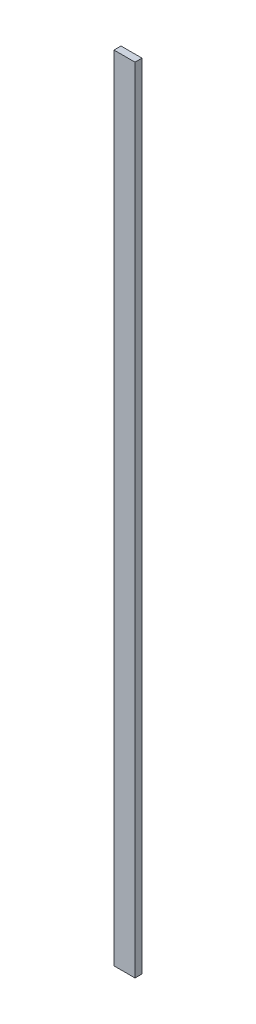
ISO-10303-21;
HEADER;
FILE_DESCRIPTION(('STEP AP214'),'2;1');
FILE_NAME('part.step','',(''),(''),'','','');
FILE_SCHEMA(('AUTOMOTIVE_DESIGN { 1 0 10303 214 1 1 1 1 }'));
ENDSEC;
DATA;
#1=APPLICATION_CONTEXT('core data for automotive mechanical design processes');
#2=APPLICATION_PROTOCOL_DEFINITION('international standard','automotive_design',2000,#1);
#3=PRODUCT_CONTEXT('',#1,'mechanical');
#4=PRODUCT('Part','Part','',(#3));
#5=PRODUCT_RELATED_PRODUCT_CATEGORY('part','',(#4));
#6=PRODUCT_DEFINITION_FORMATION('','',#4);
#7=PRODUCT_DEFINITION_CONTEXT('part definition',#1,'design');
#8=PRODUCT_DEFINITION('design','',#6,#7);
#9=PRODUCT_DEFINITION_SHAPE('','',#8);
#10=(LENGTH_UNIT() NAMED_UNIT(*) SI_UNIT(.MILLI.,.METRE.));
#11=(NAMED_UNIT(*) PLANE_ANGLE_UNIT() SI_UNIT($,.RADIAN.));
#12=(NAMED_UNIT(*) SI_UNIT($,.STERADIAN.) SOLID_ANGLE_UNIT());
#13=UNCERTAINTY_MEASURE_WITH_UNIT(LENGTH_MEASURE(1.E-05),#10,'distance_accuracy_value','');
#14=(GEOMETRIC_REPRESENTATION_CONTEXT(3) GLOBAL_UNCERTAINTY_ASSIGNED_CONTEXT((#13)) GLOBAL_UNIT_ASSIGNED_CONTEXT((#10,
#11,#12)) REPRESENTATION_CONTEXT('',''));
#15=CARTESIAN_POINT('',(0.,0.,0.));
#16=DIRECTION('',(0.,0.,1.));
#17=DIRECTION('',(1.,0.,0.));
#18=AXIS2_PLACEMENT_3D('',#15,#16,#17);
#19=CARTESIAN_POINT('',(45.,3400.,15.));
#20=DIRECTION('',(-1.,0.,0.));
#21=DIRECTION('',(0.,0.,1.));
#22=AXIS2_PLACEMENT_3D('',#19,#20,#21);
#23=PLANE('',#22);
#24=DIRECTION('',(0.,0.,-1.));
#25=VECTOR('',#24,1.);
#26=CARTESIAN_POINT('',(45.,0.,15.));
#27=LINE('',#26,#25);
#28=CARTESIAN_POINT('',(45.,0.,15.));
#29=VERTEX_POINT('',#28);
#30=CARTESIAN_POINT('',(45.,0.,-15.));
#31=VERTEX_POINT('',#30);
#32=EDGE_CURVE('E80',#29,#31,#27,.T.);
#33=ORIENTED_EDGE('',*,*,#32,.T.);
#34=DIRECTION('',(0.,-1.,0.));
#35=VECTOR('',#34,1.);
#36=CARTESIAN_POINT('',(45.,3400.,-15.));
#37=LINE('',#36,#35);
#38=CARTESIAN_POINT('',(45.,3400.,-15.));
#39=VERTEX_POINT('',#38);
#40=EDGE_CURVE('E11',#39,#31,#37,.T.);
#41=ORIENTED_EDGE('',*,*,#40,.F.);
#42=DIRECTION('',(0.,0.,-1.));
#43=VECTOR('',#42,1.);
#44=CARTESIAN_POINT('',(45.,3400.,15.));
#45=LINE('',#44,#43);
#46=CARTESIAN_POINT('',(45.,3400.,15.));
#47=VERTEX_POINT('',#46);
#48=EDGE_CURVE('E68',#47,#39,#45,.T.);
#49=ORIENTED_EDGE('',*,*,#48,.F.);
#50=DIRECTION('',(0.,-1.,0.));
#51=VECTOR('',#50,1.);
#52=CARTESIAN_POINT('',(45.,3400.,15.));
#53=LINE('',#52,#51);
#54=EDGE_CURVE('E76',#47,#29,#53,.T.);
#55=ORIENTED_EDGE('',*,*,#54,.T.);
#56=EDGE_LOOP('',(#33,#41,#49,#55));
#57=FACE_BOUND('',#56,.T.);
#58=ADVANCED_FACE('F17',(#57),#23,.F.);
#59=CARTESIAN_POINT('',(-45.,3400.,-15.));
#60=DIRECTION('',(0.,0.,1.));
#61=DIRECTION('',(1.,0.,0.));
#62=AXIS2_PLACEMENT_3D('',#59,#60,#61);
#63=PLANE('',#62);
#64=DIRECTION('',(-1.,0.,0.));
#65=VECTOR('',#64,1.);
#66=CARTESIAN_POINT('',(-45.,0.,-15.));
#67=LINE('',#66,#65);
#68=CARTESIAN_POINT('',(-45.,0.,-15.));
#69=VERTEX_POINT('',#68);
#70=EDGE_CURVE('E72',#31,#69,#67,.T.);
#71=ORIENTED_EDGE('',*,*,#70,.T.);
#72=DIRECTION('',(0.,-1.,0.));
#73=VECTOR('',#72,1.);
#74=CARTESIAN_POINT('',(-45.,3400.,-15.));
#75=LINE('',#74,#73);
#76=CARTESIAN_POINT('',(-45.,3400.,-15.));
#77=VERTEX_POINT('',#76);
#78=EDGE_CURVE('E25',#77,#69,#75,.T.);
#79=ORIENTED_EDGE('',*,*,#78,.F.);
#80=DIRECTION('',(-1.,0.,0.));
#81=VECTOR('',#80,1.);
#82=CARTESIAN_POINT('',(-45.,3400.,-15.));
#83=LINE('',#82,#81);
#84=EDGE_CURVE('E63',#39,#77,#83,.T.);
#85=ORIENTED_EDGE('',*,*,#84,.F.);
#86=ORIENTED_EDGE('',*,*,#40,.T.);
#87=EDGE_LOOP('',(#71,#79,#85,#86));
#88=FACE_BOUND('',#87,.T.);
#89=ADVANCED_FACE('F71',(#88),#63,.F.);
#90=CARTESIAN_POINT('',(-45.,3400.,15.));
#91=DIRECTION('',(1.,0.,0.));
#92=DIRECTION('',(0.,0.,-1.));
#93=AXIS2_PLACEMENT_3D('',#90,#91,#92);
#94=PLANE('',#93);
#95=DIRECTION('',(0.,0.,1.));
#96=VECTOR('',#95,1.);
#97=CARTESIAN_POINT('',(-45.,0.,15.));
#98=LINE('',#97,#96);
#99=CARTESIAN_POINT('',(-45.,0.,15.));
#100=VERTEX_POINT('',#99);
#101=EDGE_CURVE('E50',#69,#100,#98,.T.);
#102=ORIENTED_EDGE('',*,*,#101,.T.);
#103=DIRECTION('',(0.,-1.,0.));
#104=VECTOR('',#103,1.);
#105=CARTESIAN_POINT('',(-45.,3400.,15.));
#106=LINE('',#105,#104);
#107=CARTESIAN_POINT('',(-45.,3400.,15.));
#108=VERTEX_POINT('',#107);
#109=EDGE_CURVE('E73',#108,#100,#106,.T.);
#110=ORIENTED_EDGE('',*,*,#109,.F.);
#111=DIRECTION('',(0.,0.,1.));
#112=VECTOR('',#111,1.);
#113=CARTESIAN_POINT('',(-45.,3400.,15.));
#114=LINE('',#113,#112);
#115=EDGE_CURVE('E66',#77,#108,#114,.T.);
#116=ORIENTED_EDGE('',*,*,#115,.F.);
#117=ORIENTED_EDGE('',*,*,#78,.T.);
#118=EDGE_LOOP('',(#102,#110,#116,#117));
#119=FACE_BOUND('',#118,.T.);
#120=ADVANCED_FACE('F74',(#119),#94,.F.);
#121=CARTESIAN_POINT('',(-45.,3400.,15.));
#122=DIRECTION('',(0.,0.,-1.));
#123=DIRECTION('',(-1.,0.,0.));
#124=AXIS2_PLACEMENT_3D('',#121,#122,#123);
#125=PLANE('',#124);
#126=DIRECTION('',(1.,0.,0.));
#127=VECTOR('',#126,1.);
#128=CARTESIAN_POINT('',(-45.,0.,15.));
#129=LINE('',#128,#127);
#130=EDGE_CURVE('E56',#100,#29,#129,.T.);
#131=ORIENTED_EDGE('',*,*,#130,.T.);
#132=ORIENTED_EDGE('',*,*,#54,.F.);
#133=DIRECTION('',(1.,0.,0.));
#134=VECTOR('',#133,1.);
#135=CARTESIAN_POINT('',(-45.,3400.,15.));
#136=LINE('',#135,#134);
#137=EDGE_CURVE('E33',#108,#47,#136,.T.);
#138=ORIENTED_EDGE('',*,*,#137,.F.);
#139=ORIENTED_EDGE('',*,*,#109,.T.);
#140=EDGE_LOOP('',(#131,#132,#138,#139));
#141=FACE_BOUND('',#140,.T.);
#142=ADVANCED_FACE('F87',(#141),#125,.F.);
#143=CARTESIAN_POINT('',(0.,3400.,0.));
#144=DIRECTION('',(0.,-1.,0.));
#145=DIRECTION('',(0.,0.,-1.));
#146=AXIS2_PLACEMENT_3D('',#143,#144,#145);
#147=PLANE('',#146);
#148=ORIENTED_EDGE('',*,*,#48,.T.);
#149=ORIENTED_EDGE('',*,*,#84,.T.);
#150=ORIENTED_EDGE('',*,*,#115,.T.);
#151=ORIENTED_EDGE('',*,*,#137,.T.);
#152=EDGE_LOOP('',(#148,#149,#150,#151));
#153=FACE_BOUND('',#152,.T.);
#154=ADVANCED_FACE('F64',(#153),#147,.F.);
#155=CARTESIAN_POINT('',(0.,0.,0.));
#156=DIRECTION('',(0.,-1.,0.));
#157=DIRECTION('',(0.,0.,-1.));
#158=AXIS2_PLACEMENT_3D('',#155,#156,#157);
#159=PLANE('',#158);
#160=ORIENTED_EDGE('',*,*,#32,.F.);
#161=ORIENTED_EDGE('',*,*,#130,.F.);
#162=ORIENTED_EDGE('',*,*,#101,.F.);
#163=ORIENTED_EDGE('',*,*,#70,.F.);
#164=EDGE_LOOP('',(#160,#161,#162,#163));
#165=FACE_BOUND('',#164,.T.);
#166=ADVANCED_FACE('F90',(#165),#159,.T.);
#167=CLOSED_SHELL('',(#58,#89,#120,#142,#154,#166));
#168=MANIFOLD_SOLID_BREP('B1',#167);
#169=ADVANCED_BREP_SHAPE_REPRESENTATION('',(#18,#168),#14);
#170=SHAPE_DEFINITION_REPRESENTATION(#9,#169);
ENDSEC;
END-ISO-10303-21;
